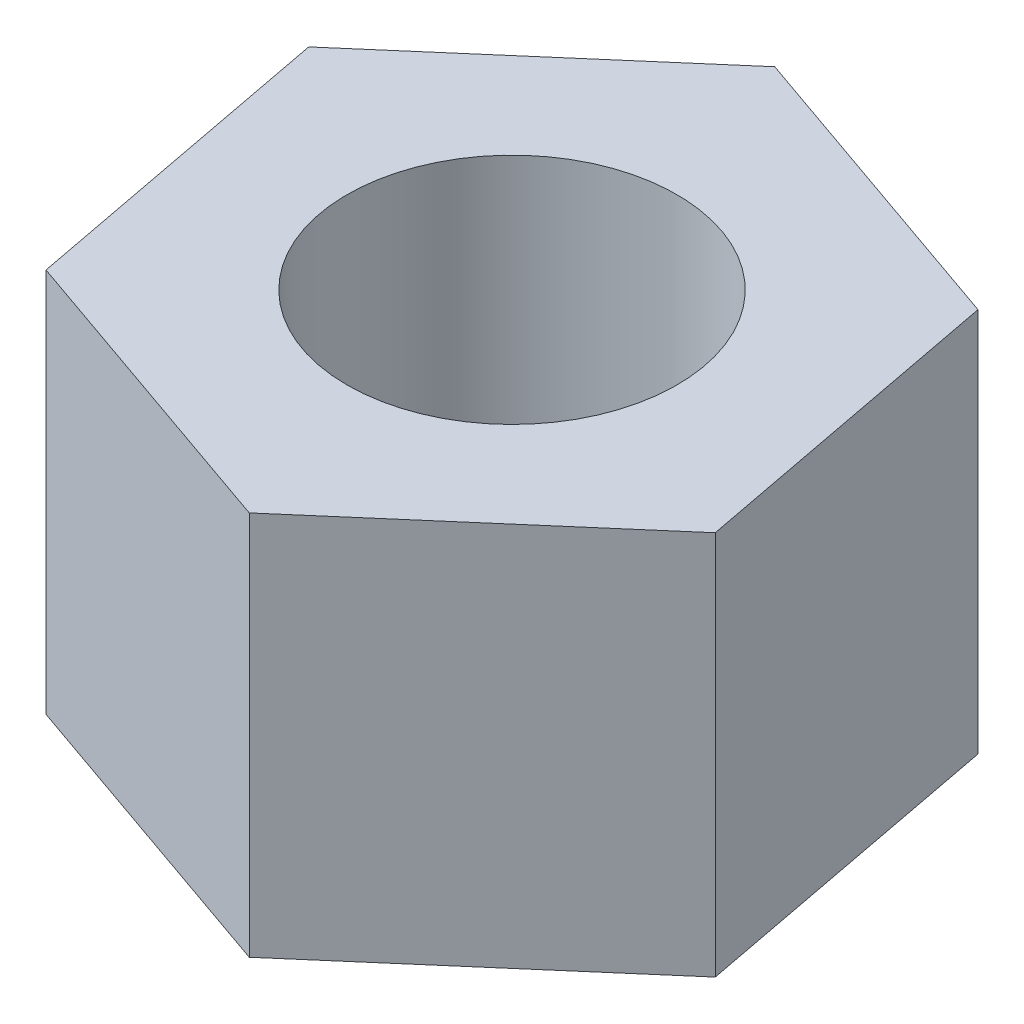
ISO-10303-21;
HEADER;
FILE_DESCRIPTION(('STEP AP214'),'2;1');
FILE_NAME('part.step','',(''),(''),'','','');
FILE_SCHEMA(('AUTOMOTIVE_DESIGN { 1 0 10303 214 1 1 1 1 }'));
ENDSEC;
DATA;
#1=APPLICATION_CONTEXT('core data for automotive mechanical design processes');
#2=APPLICATION_PROTOCOL_DEFINITION('international standard','automotive_design',2000,#1);
#3=PRODUCT_CONTEXT('',#1,'mechanical');
#4=PRODUCT('Part','Part','',(#3));
#5=PRODUCT_RELATED_PRODUCT_CATEGORY('part','',(#4));
#6=PRODUCT_DEFINITION_FORMATION('','',#4);
#7=PRODUCT_DEFINITION_CONTEXT('part definition',#1,'design');
#8=PRODUCT_DEFINITION('design','',#6,#7);
#9=PRODUCT_DEFINITION_SHAPE('','',#8);
#10=(LENGTH_UNIT() NAMED_UNIT(*) SI_UNIT(.MILLI.,.METRE.));
#11=(NAMED_UNIT(*) PLANE_ANGLE_UNIT() SI_UNIT($,.RADIAN.));
#12=(NAMED_UNIT(*) SI_UNIT($,.STERADIAN.) SOLID_ANGLE_UNIT());
#13=UNCERTAINTY_MEASURE_WITH_UNIT(LENGTH_MEASURE(1.E-05),#10,'distance_accuracy_value','');
#14=(GEOMETRIC_REPRESENTATION_CONTEXT(3) GLOBAL_UNCERTAINTY_ASSIGNED_CONTEXT((#13)) GLOBAL_UNIT_ASSIGNED_CONTEXT((#10,
#11,#12)) REPRESENTATION_CONTEXT('',''));
#15=CARTESIAN_POINT('',(0.,0.,0.));
#16=DIRECTION('',(0.,0.,1.));
#17=DIRECTION('',(1.,0.,0.));
#18=AXIS2_PLACEMENT_3D('',#15,#16,#17);
#19=CARTESIAN_POINT('',(-2.27530816958061,3.5,1.9629054316089));
#20=DIRECTION('',(0.329125444422839,0.,-0.944286207584051));
#21=DIRECTION('',(-0.944286207584051,0.,-0.329125444422839));
#22=AXIS2_PLACEMENT_3D('',#19,#20,#21);
#23=PLANE('',#22);
#24=DIRECTION('',(0.944286207584051,0.,0.329125444422839));
#25=VECTOR('',#24,1.);
#26=CARTESIAN_POINT('',(-2.27530816958061,0.,1.9629054316089));
#27=LINE('',#26,#25);
#28=CARTESIAN_POINT('',(-2.27530816958061,0.,1.9629054316089));
#29=VERTEX_POINT('',#28);
#30=CARTESIAN_POINT('',(0.562271884209461,0.,2.95192739209953));
#31=VERTEX_POINT('',#30);
#32=EDGE_CURVE('E117',#29,#31,#27,.T.);
#33=ORIENTED_EDGE('',*,*,#32,.T.);
#34=DIRECTION('',(0.,-1.,0.));
#35=VECTOR('',#34,1.);
#36=CARTESIAN_POINT('',(0.562271884209461,3.5,2.95192739209953));
#37=LINE('',#36,#35);
#38=CARTESIAN_POINT('',(0.562271884209461,3.5,2.95192739209953));
#39=VERTEX_POINT('',#38);
#40=EDGE_CURVE('E11',#39,#31,#37,.T.);
#41=ORIENTED_EDGE('',*,*,#40,.F.);
#42=DIRECTION('',(0.944286207584051,0.,0.329125444422839));
#43=VECTOR('',#42,1.);
#44=CARTESIAN_POINT('',(-2.27530816958061,3.5,1.9629054316089));
#45=LINE('',#44,#43);
#46=CARTESIAN_POINT('',(-2.27530816958061,3.5,1.9629054316089));
#47=VERTEX_POINT('',#46);
#48=EDGE_CURVE('E128',#47,#39,#45,.T.);
#49=ORIENTED_EDGE('',*,*,#48,.F.);
#50=DIRECTION('',(0.,-1.,0.));
#51=VECTOR('',#50,1.);
#52=CARTESIAN_POINT('',(-2.27530816958061,3.5,1.9629054316089));
#53=LINE('',#52,#51);
#54=EDGE_CURVE('E113',#47,#29,#53,.T.);
#55=ORIENTED_EDGE('',*,*,#54,.T.);
#56=EDGE_LOOP('',(#33,#41,#49,#55));
#57=FACE_BOUND('',#56,.T.);
#58=ADVANCED_FACE('F33',(#57),#23,.F.);
#59=CARTESIAN_POINT('',(0.562271884209461,3.5,2.95192739209953));
#60=DIRECTION('',(-0.653213121999635,0.,-0.757174099694047));
#61=DIRECTION('',(-0.757174099694047,0.,0.653213121999635));
#62=AXIS2_PLACEMENT_3D('',#59,#60,#61);
#63=PLANE('',#62);
#64=DIRECTION('',(0.757174099694047,0.,-0.653213121999635));
#65=VECTOR('',#64,1.);
#66=CARTESIAN_POINT('',(0.562271884209461,0.,2.95192739209953));
#67=LINE('',#66,#65);
#68=CARTESIAN_POINT('',(2.83758005379007,0.,0.98902196049063));
#69=VERTEX_POINT('',#68);
#70=EDGE_CURVE('E120',#31,#69,#67,.T.);
#71=ORIENTED_EDGE('',*,*,#70,.T.);
#72=DIRECTION('',(0.,-1.,0.));
#73=VECTOR('',#72,1.);
#74=CARTESIAN_POINT('',(2.83758005379007,3.5,0.98902196049063));
#75=LINE('',#74,#73);
#76=CARTESIAN_POINT('',(2.83758005379007,3.5,0.98902196049063));
#77=VERTEX_POINT('',#76);
#78=EDGE_CURVE('E41',#77,#69,#75,.T.);
#79=ORIENTED_EDGE('',*,*,#78,.F.);
#80=DIRECTION('',(0.757174099694047,0.,-0.653213121999635));
#81=VECTOR('',#80,1.);
#82=CARTESIAN_POINT('',(0.562271884209461,3.5,2.95192739209953));
#83=LINE('',#82,#81);
#84=EDGE_CURVE('E86',#39,#77,#83,.T.);
#85=ORIENTED_EDGE('',*,*,#84,.F.);
#86=ORIENTED_EDGE('',*,*,#40,.T.);
#87=EDGE_LOOP('',(#71,#79,#85,#86));
#88=FACE_BOUND('',#87,.T.);
#89=ADVANCED_FACE('F153',(#88),#63,.F.);
#90=CARTESIAN_POINT('',(2.83758005379007,3.5,0.98902196049063));
#91=DIRECTION('',(-0.982338566422473,0.,0.187112107890004));
#92=DIRECTION('',(0.187112107890004,0.,0.982338566422473));
#93=AXIS2_PLACEMENT_3D('',#90,#91,#92);
#94=PLANE('',#93);
#95=DIRECTION('',(-0.187112107890004,0.,-0.982338566422473));
#96=VECTOR('',#95,1.);
#97=CARTESIAN_POINT('',(2.83758005379007,0.,0.98902196049063));
#98=LINE('',#97,#96);
#99=CARTESIAN_POINT('',(2.27530816958061,0.,-1.9629054316089));
#100=VERTEX_POINT('',#99);
#101=EDGE_CURVE('E123',#69,#100,#98,.T.);
#102=ORIENTED_EDGE('',*,*,#101,.T.);
#103=DIRECTION('',(0.,-1.,0.));
#104=VECTOR('',#103,1.);
#105=CARTESIAN_POINT('',(2.27530816958061,3.5,-1.9629054316089));
#106=LINE('',#105,#104);
#107=CARTESIAN_POINT('',(2.27530816958061,3.5,-1.9629054316089));
#108=VERTEX_POINT('',#107);
#109=EDGE_CURVE('E108',#108,#100,#106,.T.);
#110=ORIENTED_EDGE('',*,*,#109,.F.);
#111=DIRECTION('',(-0.187112107890004,0.,-0.982338566422473));
#112=VECTOR('',#111,1.);
#113=CARTESIAN_POINT('',(2.83758005379007,3.5,0.98902196049063));
#114=LINE('',#113,#112);
#115=EDGE_CURVE('E99',#77,#108,#114,.T.);
#116=ORIENTED_EDGE('',*,*,#115,.F.);
#117=ORIENTED_EDGE('',*,*,#78,.T.);
#118=EDGE_LOOP('',(#102,#110,#116,#117));
#119=FACE_BOUND('',#118,.T.);
#120=ADVANCED_FACE('F134',(#119),#94,.F.);
#121=CARTESIAN_POINT('',(2.27530816958061,3.5,-1.9629054316089));
#122=DIRECTION('',(-0.329125444422839,0.,0.944286207584051));
#123=DIRECTION('',(0.944286207584051,0.,0.329125444422839));
#124=AXIS2_PLACEMENT_3D('',#121,#122,#123);
#125=PLANE('',#124);
#126=DIRECTION('',(-0.944286207584051,0.,-0.329125444422839));
#127=VECTOR('',#126,1.);
#128=CARTESIAN_POINT('',(2.27530816958061,0.,-1.9629054316089));
#129=LINE('',#128,#127);
#130=CARTESIAN_POINT('',(-0.562271884209461,0.,-2.95192739209953));
#131=VERTEX_POINT('',#130);
#132=EDGE_CURVE('E107',#100,#131,#129,.T.);
#133=ORIENTED_EDGE('',*,*,#132,.T.);
#134=DIRECTION('',(0.,-1.,0.));
#135=VECTOR('',#134,1.);
#136=CARTESIAN_POINT('',(-0.562271884209461,3.5,-2.95192739209953));
#137=LINE('',#136,#135);
#138=CARTESIAN_POINT('',(-0.562271884209461,3.5,-2.95192739209953));
#139=VERTEX_POINT('',#138);
#140=EDGE_CURVE('E104',#139,#131,#137,.T.);
#141=ORIENTED_EDGE('',*,*,#140,.F.);
#142=DIRECTION('',(-0.944286207584051,0.,-0.329125444422839));
#143=VECTOR('',#142,1.);
#144=CARTESIAN_POINT('',(2.27530816958061,3.5,-1.9629054316089));
#145=LINE('',#144,#143);
#146=EDGE_CURVE('E93',#108,#139,#145,.T.);
#147=ORIENTED_EDGE('',*,*,#146,.F.);
#148=ORIENTED_EDGE('',*,*,#109,.T.);
#149=EDGE_LOOP('',(#133,#141,#147,#148));
#150=FACE_BOUND('',#149,.T.);
#151=ADVANCED_FACE('F105',(#150),#125,.F.);
#152=CARTESIAN_POINT('',(-0.562271884209461,3.5,-2.95192739209953));
#153=DIRECTION('',(0.653213121999635,0.,0.757174099694047));
#154=DIRECTION('',(0.757174099694047,0.,-0.653213121999635));
#155=AXIS2_PLACEMENT_3D('',#152,#153,#154);
#156=PLANE('',#155);
#157=DIRECTION('',(-0.757174099694047,0.,0.653213121999635));
#158=VECTOR('',#157,1.);
#159=CARTESIAN_POINT('',(-0.562271884209461,0.,-2.95192739209953));
#160=LINE('',#159,#158);
#161=CARTESIAN_POINT('',(-2.83758005379007,0.,-0.98902196049063));
#162=VERTEX_POINT('',#161);
#163=EDGE_CURVE('E72',#131,#162,#160,.T.);
#164=ORIENTED_EDGE('',*,*,#163,.T.);
#165=DIRECTION('',(0.,-1.,0.));
#166=VECTOR('',#165,1.);
#167=CARTESIAN_POINT('',(-2.83758005379007,3.5,-0.98902196049063));
#168=LINE('',#167,#166);
#169=CARTESIAN_POINT('',(-2.83758005379007,3.5,-0.98902196049063));
#170=VERTEX_POINT('',#169);
#171=EDGE_CURVE('E109',#170,#162,#168,.T.);
#172=ORIENTED_EDGE('',*,*,#171,.F.);
#173=DIRECTION('',(-0.757174099694047,0.,0.653213121999635));
#174=VECTOR('',#173,1.);
#175=CARTESIAN_POINT('',(-0.562271884209461,3.5,-2.95192739209953));
#176=LINE('',#175,#174);
#177=EDGE_CURVE('E97',#139,#170,#176,.T.);
#178=ORIENTED_EDGE('',*,*,#177,.F.);
#179=ORIENTED_EDGE('',*,*,#140,.T.);
#180=EDGE_LOOP('',(#164,#172,#178,#179));
#181=FACE_BOUND('',#180,.T.);
#182=ADVANCED_FACE('F111',(#181),#156,.F.);
#183=CARTESIAN_POINT('',(-2.83758005379007,3.5,-0.98902196049063));
#184=DIRECTION('',(0.982338566422473,0.,-0.187112107890004));
#185=DIRECTION('',(-0.187112107890004,0.,-0.982338566422473));
#186=AXIS2_PLACEMENT_3D('',#183,#184,#185);
#187=PLANE('',#186);
#188=DIRECTION('',(0.187112107890004,0.,0.982338566422473));
#189=VECTOR('',#188,1.);
#190=CARTESIAN_POINT('',(-2.83758005379007,0.,-0.98902196049063));
#191=LINE('',#190,#189);
#192=EDGE_CURVE('E78',#162,#29,#191,.T.);
#193=ORIENTED_EDGE('',*,*,#192,.T.);
#194=ORIENTED_EDGE('',*,*,#54,.F.);
#195=DIRECTION('',(0.187112107890004,0.,0.982338566422473));
#196=VECTOR('',#195,1.);
#197=CARTESIAN_POINT('',(-2.83758005379007,3.5,-0.98902196049063));
#198=LINE('',#197,#196);
#199=EDGE_CURVE('E49',#170,#47,#198,.T.);
#200=ORIENTED_EDGE('',*,*,#199,.F.);
#201=ORIENTED_EDGE('',*,*,#171,.T.);
#202=EDGE_LOOP('',(#193,#194,#200,#201));
#203=FACE_BOUND('',#202,.T.);
#204=ADVANCED_FACE('F141',(#203),#187,.F.);
#205=CARTESIAN_POINT('',(0.,3.5,0.));
#206=DIRECTION('',(0.,1.,0.));
#207=DIRECTION('',(0.,0.,1.));
#208=AXIS2_PLACEMENT_3D('',#205,#206,#207);
#209=PLANE('',#208);
#210=CARTESIAN_POINT('',(0.,3.5,0.));
#211=DIRECTION('',(0.,1.,0.));
#212=DIRECTION('',(0.,0.,1.));
#213=AXIS2_PLACEMENT_3D('',#210,#211,#212);
#214=CIRCLE('',#213,1.5);
#215=CARTESIAN_POINT('',(0.,3.5,1.5));
#216=VERTEX_POINT('',#215);
#217=EDGE_CURVE('E208',#216,#216,#214,.T.);
#218=ORIENTED_EDGE('',*,*,#217,.F.);
#219=EDGE_LOOP('',(#218));
#220=FACE_BOUND('',#219,.T.);
#221=ORIENTED_EDGE('',*,*,#48,.T.);
#222=ORIENTED_EDGE('',*,*,#84,.T.);
#223=ORIENTED_EDGE('',*,*,#115,.T.);
#224=ORIENTED_EDGE('',*,*,#146,.T.);
#225=ORIENTED_EDGE('',*,*,#177,.T.);
#226=ORIENTED_EDGE('',*,*,#199,.T.);
#227=EDGE_LOOP('',(#221,#222,#223,#224,#225,#226));
#228=FACE_BOUND('',#227,.T.);
#229=ADVANCED_FACE('F95',(#220,#228),#209,.T.);
#230=CARTESIAN_POINT('',(0.,0.,0.));
#231=DIRECTION('',(0.,1.,0.));
#232=DIRECTION('',(0.,0.,1.));
#233=AXIS2_PLACEMENT_3D('',#230,#231,#232);
#234=PLANE('',#233);
#235=CARTESIAN_POINT('',(0.,0.,0.));
#236=DIRECTION('',(0.,1.,0.));
#237=DIRECTION('',(0.,0.,1.));
#238=AXIS2_PLACEMENT_3D('',#235,#236,#237);
#239=CIRCLE('',#238,1.5);
#240=CARTESIAN_POINT('',(0.,0.,1.5));
#241=VERTEX_POINT('',#240);
#242=EDGE_CURVE('E121',#241,#241,#239,.T.);
#243=ORIENTED_EDGE('',*,*,#242,.T.);
#244=EDGE_LOOP('',(#243));
#245=FACE_BOUND('',#244,.T.);
#246=ORIENTED_EDGE('',*,*,#32,.F.);
#247=ORIENTED_EDGE('',*,*,#192,.F.);
#248=ORIENTED_EDGE('',*,*,#163,.F.);
#249=ORIENTED_EDGE('',*,*,#132,.F.);
#250=ORIENTED_EDGE('',*,*,#101,.F.);
#251=ORIENTED_EDGE('',*,*,#70,.F.);
#252=EDGE_LOOP('',(#246,#247,#248,#249,#250,#251));
#253=FACE_BOUND('',#252,.T.);
#254=ADVANCED_FACE('F137',(#245,#253),#234,.F.);
#255=CARTESIAN_POINT('',(0.,0.,0.));
#256=DIRECTION('',(0.,1.,0.));
#257=DIRECTION('',(0.,0.,1.));
#258=AXIS2_PLACEMENT_3D('',#255,#256,#257);
#259=CYLINDRICAL_SURFACE('',#258,1.5);
#260=ORIENTED_EDGE('',*,*,#242,.F.);
#261=EDGE_LOOP('',(#260));
#262=FACE_BOUND('',#261,.T.);
#263=ORIENTED_EDGE('',*,*,#217,.T.);
#264=EDGE_LOOP('',(#263));
#265=FACE_BOUND('',#264,.T.);
#266=ADVANCED_FACE('F190',(#262,#265),#259,.F.);
#267=CLOSED_SHELL('',(#58,#89,#120,#151,#182,#204,#229,#254,#266));
#268=MANIFOLD_SOLID_BREP('B2',#267);
#269=ADVANCED_BREP_SHAPE_REPRESENTATION('',(#18,#268),#14);
#270=SHAPE_DEFINITION_REPRESENTATION(#9,#269);
ENDSEC;
END-ISO-10303-21;
